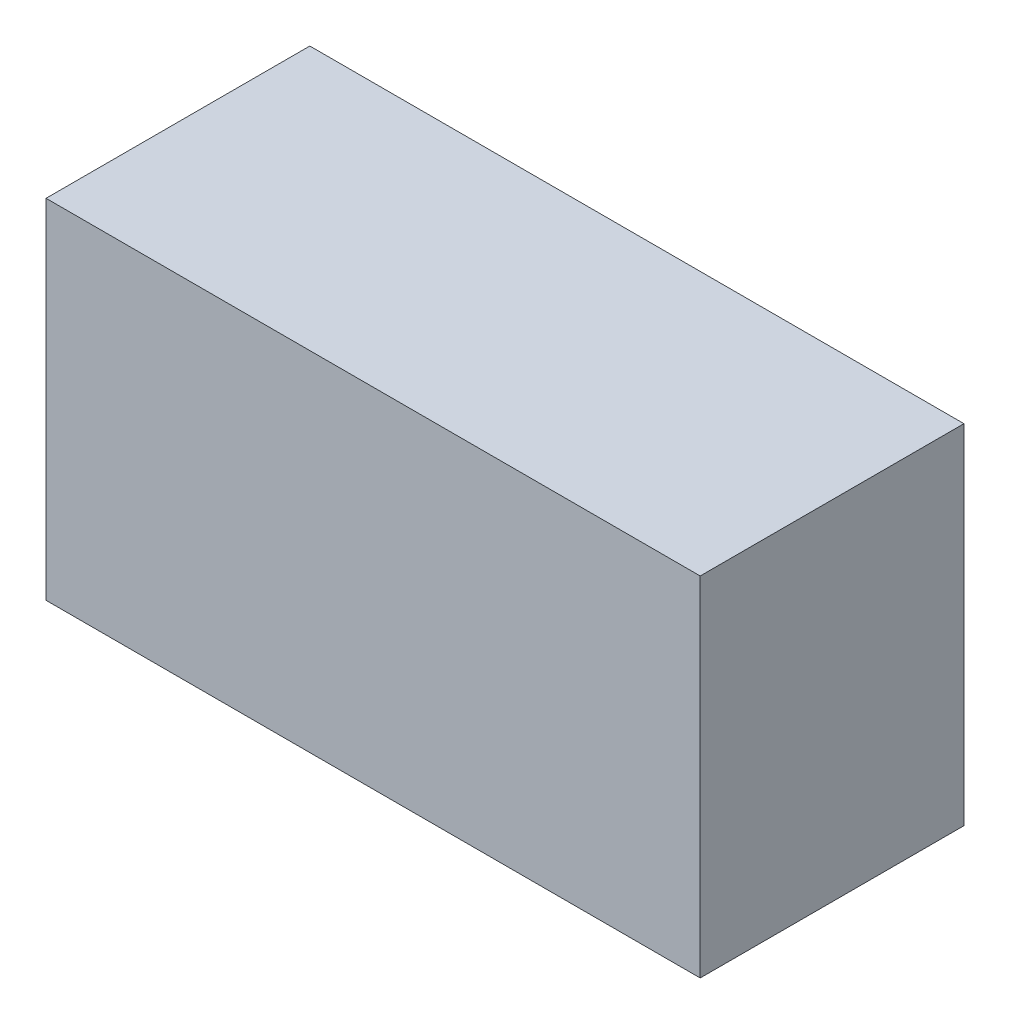
ISO-10303-21;
HEADER;
FILE_DESCRIPTION(('STEP AP214'),'2;1');
FILE_NAME('part.step','',(''),(''),'','','');
FILE_SCHEMA(('AUTOMOTIVE_DESIGN { 1 0 10303 214 1 1 1 1 }'));
ENDSEC;
DATA;
#1=APPLICATION_CONTEXT('core data for automotive mechanical design processes');
#2=APPLICATION_PROTOCOL_DEFINITION('international standard','automotive_design',2000,#1);
#3=PRODUCT_CONTEXT('',#1,'mechanical');
#4=PRODUCT('Part','Part','',(#3));
#5=PRODUCT_RELATED_PRODUCT_CATEGORY('part','',(#4));
#6=PRODUCT_DEFINITION_FORMATION('','',#4);
#7=PRODUCT_DEFINITION_CONTEXT('part definition',#1,'design');
#8=PRODUCT_DEFINITION('design','',#6,#7);
#9=PRODUCT_DEFINITION_SHAPE('','',#8);
#10=(LENGTH_UNIT() NAMED_UNIT(*) SI_UNIT(.MILLI.,.METRE.));
#11=(NAMED_UNIT(*) PLANE_ANGLE_UNIT() SI_UNIT($,.RADIAN.));
#12=(NAMED_UNIT(*) SI_UNIT($,.STERADIAN.) SOLID_ANGLE_UNIT());
#13=UNCERTAINTY_MEASURE_WITH_UNIT(LENGTH_MEASURE(1.E-05),#10,'distance_accuracy_value','');
#14=(GEOMETRIC_REPRESENTATION_CONTEXT(3) GLOBAL_UNCERTAINTY_ASSIGNED_CONTEXT((#13)) GLOBAL_UNIT_ASSIGNED_CONTEXT((#10,
#11,#12)) REPRESENTATION_CONTEXT('',''));
#15=CARTESIAN_POINT('',(0.,0.,0.));
#16=DIRECTION('',(0.,0.,1.));
#17=DIRECTION('',(1.,0.,0.));
#18=AXIS2_PLACEMENT_3D('',#15,#16,#17);
#19=CARTESIAN_POINT('',(0.,33.,-25.));
#20=DIRECTION('',(1.,0.,0.));
#21=DIRECTION('',(0.,0.,-1.));
#22=AXIS2_PLACEMENT_3D('',#19,#20,#21);
#23=PLANE('',#22);
#24=DIRECTION('',(0.,0.,1.));
#25=VECTOR('',#24,1.);
#26=CARTESIAN_POINT('',(0.,0.,-25.));
#27=LINE('',#26,#25);
#28=CARTESIAN_POINT('',(0.,0.,-25.));
#29=VERTEX_POINT('',#28);
#30=CARTESIAN_POINT('',(0.,0.,0.));
#31=VERTEX_POINT('',#30);
#32=EDGE_CURVE('E103',#29,#31,#27,.T.);
#33=ORIENTED_EDGE('',*,*,#32,.T.);
#34=DIRECTION('',(0.,-1.,0.));
#35=VECTOR('',#34,1.);
#36=CARTESIAN_POINT('',(0.,33.,0.));
#37=LINE('',#36,#35);
#38=CARTESIAN_POINT('',(0.,33.,0.));
#39=VERTEX_POINT('',#38);
#40=EDGE_CURVE('E11',#39,#31,#37,.T.);
#41=ORIENTED_EDGE('',*,*,#40,.F.);
#42=DIRECTION('',(0.,0.,1.));
#43=VECTOR('',#42,1.);
#44=CARTESIAN_POINT('',(0.,33.,-25.));
#45=LINE('',#44,#43);
#46=CARTESIAN_POINT('',(0.,33.,-25.));
#47=VERTEX_POINT('',#46);
#48=EDGE_CURVE('E91',#47,#39,#45,.T.);
#49=ORIENTED_EDGE('',*,*,#48,.F.);
#50=DIRECTION('',(0.,-1.,0.));
#51=VECTOR('',#50,1.);
#52=CARTESIAN_POINT('',(0.,33.,-25.));
#53=LINE('',#52,#51);
#54=EDGE_CURVE('E99',#47,#29,#53,.T.);
#55=ORIENTED_EDGE('',*,*,#54,.T.);
#56=EDGE_LOOP('',(#33,#41,#49,#55));
#57=FACE_BOUND('',#56,.T.);
#58=ADVANCED_FACE('F40',(#57),#23,.F.);
#59=CARTESIAN_POINT('',(0.,33.,0.));
#60=DIRECTION('',(0.,0.,-1.));
#61=DIRECTION('',(-1.,0.,0.));
#62=AXIS2_PLACEMENT_3D('',#59,#60,#61);
#63=PLANE('',#62);
#64=DIRECTION('',(1.,0.,0.));
#65=VECTOR('',#64,1.);
#66=CARTESIAN_POINT('',(0.,0.,0.));
#67=LINE('',#66,#65);
#68=CARTESIAN_POINT('',(62.,0.,0.));
#69=VERTEX_POINT('',#68);
#70=EDGE_CURVE('E95',#31,#69,#67,.T.);
#71=ORIENTED_EDGE('',*,*,#70,.T.);
#72=DIRECTION('',(0.,-1.,0.));
#73=VECTOR('',#72,1.);
#74=CARTESIAN_POINT('',(62.,33.,0.));
#75=LINE('',#74,#73);
#76=CARTESIAN_POINT('',(62.,33.,0.));
#77=VERTEX_POINT('',#76);
#78=EDGE_CURVE('E48',#77,#69,#75,.T.);
#79=ORIENTED_EDGE('',*,*,#78,.F.);
#80=DIRECTION('',(1.,0.,0.));
#81=VECTOR('',#80,1.);
#82=CARTESIAN_POINT('',(0.,33.,0.));
#83=LINE('',#82,#81);
#84=EDGE_CURVE('E86',#39,#77,#83,.T.);
#85=ORIENTED_EDGE('',*,*,#84,.F.);
#86=ORIENTED_EDGE('',*,*,#40,.T.);
#87=EDGE_LOOP('',(#71,#79,#85,#86));
#88=FACE_BOUND('',#87,.T.);
#89=ADVANCED_FACE('F94',(#88),#63,.F.);
#90=CARTESIAN_POINT('',(62.,33.,-25.));
#91=DIRECTION('',(-1.,0.,0.));
#92=DIRECTION('',(0.,0.,1.));
#93=AXIS2_PLACEMENT_3D('',#90,#91,#92);
#94=PLANE('',#93);
#95=DIRECTION('',(0.,0.,-1.));
#96=VECTOR('',#95,1.);
#97=CARTESIAN_POINT('',(62.,0.,-25.));
#98=LINE('',#97,#96);
#99=CARTESIAN_POINT('',(62.,0.,-25.));
#100=VERTEX_POINT('',#99);
#101=EDGE_CURVE('E73',#69,#100,#98,.T.);
#102=ORIENTED_EDGE('',*,*,#101,.T.);
#103=DIRECTION('',(0.,-1.,0.));
#104=VECTOR('',#103,1.);
#105=CARTESIAN_POINT('',(62.,33.,-25.));
#106=LINE('',#105,#104);
#107=CARTESIAN_POINT('',(62.,33.,-25.));
#108=VERTEX_POINT('',#107);
#109=EDGE_CURVE('E96',#108,#100,#106,.T.);
#110=ORIENTED_EDGE('',*,*,#109,.F.);
#111=DIRECTION('',(0.,0.,-1.));
#112=VECTOR('',#111,1.);
#113=CARTESIAN_POINT('',(62.,33.,-25.));
#114=LINE('',#113,#112);
#115=EDGE_CURVE('E89',#77,#108,#114,.T.);
#116=ORIENTED_EDGE('',*,*,#115,.F.);
#117=ORIENTED_EDGE('',*,*,#78,.T.);
#118=EDGE_LOOP('',(#102,#110,#116,#117));
#119=FACE_BOUND('',#118,.T.);
#120=ADVANCED_FACE('F97',(#119),#94,.F.);
#121=CARTESIAN_POINT('',(0.,33.,-25.));
#122=DIRECTION('',(0.,0.,1.));
#123=DIRECTION('',(1.,0.,0.));
#124=AXIS2_PLACEMENT_3D('',#121,#122,#123);
#125=PLANE('',#124);
#126=DIRECTION('',(-1.,0.,0.));
#127=VECTOR('',#126,1.);
#128=CARTESIAN_POINT('',(0.,0.,-25.));
#129=LINE('',#128,#127);
#130=EDGE_CURVE('E79',#100,#29,#129,.T.);
#131=ORIENTED_EDGE('',*,*,#130,.T.);
#132=ORIENTED_EDGE('',*,*,#54,.F.);
#133=DIRECTION('',(-1.,0.,0.));
#134=VECTOR('',#133,1.);
#135=CARTESIAN_POINT('',(0.,33.,-25.));
#136=LINE('',#135,#134);
#137=EDGE_CURVE('E56',#108,#47,#136,.T.);
#138=ORIENTED_EDGE('',*,*,#137,.F.);
#139=ORIENTED_EDGE('',*,*,#109,.T.);
#140=EDGE_LOOP('',(#131,#132,#138,#139));
#141=FACE_BOUND('',#140,.T.);
#142=ADVANCED_FACE('F110',(#141),#125,.F.);
#143=CARTESIAN_POINT('',(0.,33.,0.));
#144=DIRECTION('',(0.,1.,0.));
#145=DIRECTION('',(0.,0.,1.));
#146=AXIS2_PLACEMENT_3D('',#143,#144,#145);
#147=PLANE('',#146);
#148=ORIENTED_EDGE('',*,*,#48,.T.);
#149=ORIENTED_EDGE('',*,*,#84,.T.);
#150=ORIENTED_EDGE('',*,*,#115,.T.);
#151=ORIENTED_EDGE('',*,*,#137,.T.);
#152=EDGE_LOOP('',(#148,#149,#150,#151));
#153=FACE_BOUND('',#152,.T.);
#154=ADVANCED_FACE('F87',(#153),#147,.T.);
#155=CARTESIAN_POINT('',(0.,0.,0.));
#156=DIRECTION('',(0.,1.,0.));
#157=DIRECTION('',(0.,0.,1.));
#158=AXIS2_PLACEMENT_3D('',#155,#156,#157);
#159=PLANE('',#158);
#160=ORIENTED_EDGE('',*,*,#32,.F.);
#161=ORIENTED_EDGE('',*,*,#130,.F.);
#162=ORIENTED_EDGE('',*,*,#101,.F.);
#163=ORIENTED_EDGE('',*,*,#70,.F.);
#164=EDGE_LOOP('',(#160,#161,#162,#163));
#165=FACE_BOUND('',#164,.T.);
#166=ADVANCED_FACE('F113',(#165),#159,.F.);
#167=CLOSED_SHELL('',(#58,#89,#120,#142,#154,#166));
#168=MANIFOLD_SOLID_BREP('B2',#167);
#169=ADVANCED_BREP_SHAPE_REPRESENTATION('',(#18,#168),#14);
#170=SHAPE_DEFINITION_REPRESENTATION(#9,#169);
ENDSEC;
END-ISO-10303-21;
